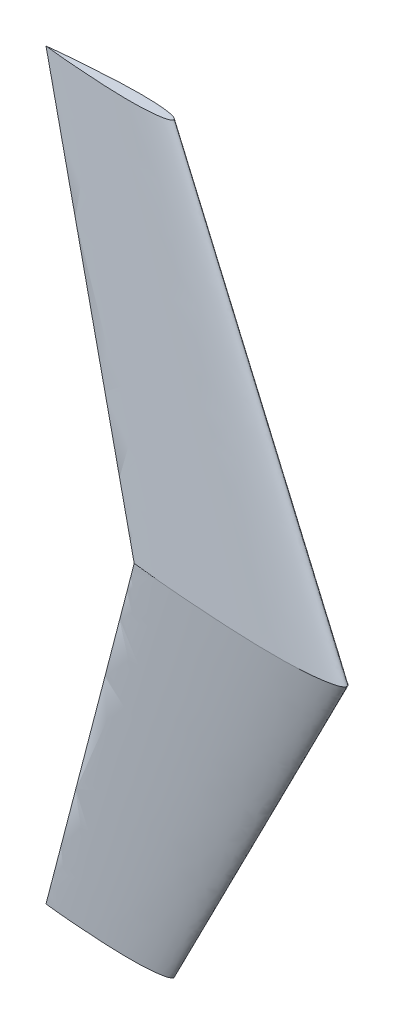
ISO-10303-21;
HEADER;
FILE_DESCRIPTION(('STEP AP214'),'2;1');
FILE_NAME('part.step','',(''),(''),'','','');
FILE_SCHEMA(('AUTOMOTIVE_DESIGN { 1 0 10303 214 1 1 1 1 }'));
ENDSEC;
DATA;
#1=APPLICATION_CONTEXT('core data for automotive mechanical design processes');
#2=APPLICATION_PROTOCOL_DEFINITION('international standard','automotive_design',2000,#1);
#3=PRODUCT_CONTEXT('',#1,'mechanical');
#4=PRODUCT('Part','Part','',(#3));
#5=PRODUCT_RELATED_PRODUCT_CATEGORY('part','',(#4));
#6=PRODUCT_DEFINITION_FORMATION('','',#4);
#7=PRODUCT_DEFINITION_CONTEXT('part definition',#1,'design');
#8=PRODUCT_DEFINITION('design','',#6,#7);
#9=PRODUCT_DEFINITION_SHAPE('','',#8);
#10=(LENGTH_UNIT() NAMED_UNIT(*) SI_UNIT(.MILLI.,.METRE.));
#11=(NAMED_UNIT(*) PLANE_ANGLE_UNIT() SI_UNIT($,.RADIAN.));
#12=(NAMED_UNIT(*) SI_UNIT($,.STERADIAN.) SOLID_ANGLE_UNIT());
#13=UNCERTAINTY_MEASURE_WITH_UNIT(LENGTH_MEASURE(1.E-05),#10,'distance_accuracy_value','');
#14=(GEOMETRIC_REPRESENTATION_CONTEXT(3) GLOBAL_UNCERTAINTY_ASSIGNED_CONTEXT((#13)) GLOBAL_UNIT_ASSIGNED_CONTEXT((#10,
#11,#12)) REPRESENTATION_CONTEXT('',''));
#15=CARTESIAN_POINT('',(0.,0.,0.));
#16=DIRECTION('',(0.,0.,1.));
#17=DIRECTION('',(1.,0.,0.));
#18=AXIS2_PLACEMENT_3D('',#15,#16,#17);
#19=CARTESIAN_POINT('',(-5628.121523,10153.4,-888.307396177392));
#20=DIRECTION('',(1.77927965913824E-13,1.,-5.34588143750608E-13));
#21=DIRECTION('',(0.,5.34588143750608E-13,1.));
#22=AXIS2_PLACEMENT_3D('',#19,#20,#21);
#23=PLANE('',#22);
#24=CARTESIAN_POINT('',(-9121.721523,10153.4,-888.3073962));
#25=CARTESIAN_POINT('',(-9121.721523,10153.4,-888.974816669693));
#26=CARTESIAN_POINT('',(-9089.80834370601,10153.4,-891.63024737088));
#27=CARTESIAN_POINT('',(-9057.07807668989,10153.4,-897.171405392857));
#28=CARTESIAN_POINT('',(-8977.57388229286,10153.4,-905.666450738965));
#29=CARTESIAN_POINT('',(-8879.8916576995,10153.4,-916.211213285361));
#30=CARTESIAN_POINT('',(-8752.61238274034,10153.4,-928.585402677725));
#31=CARTESIAN_POINT('',(-8603.17951082771,10153.4,-942.241130984125));
#32=CARTESIAN_POINT('',(-8432.2468479322,10153.4,-956.914696759061));
#33=CARTESIAN_POINT('',(-8243.39126601854,10153.4,-972.176720474523));
#34=CARTESIAN_POINT('',(-8039.62375209268,10153.4,-987.417587350232));
#35=CARTESIAN_POINT('',(-7824.49730132489,10153.4,-1002.18570012597));
#36=CARTESIAN_POINT('',(-7601.67730037031,10153.4,-1015.80150482923));
#37=CARTESIAN_POINT('',(-7374.97893645967,10153.4,-1027.68839431318));
#38=CARTESIAN_POINT('',(-7148.27296099901,10153.4,-1037.13975746941));
#39=CARTESIAN_POINT('',(-6961.08105832747,10153.4,-1042.59965221595));
#40=CARTESIAN_POINT('',(-6814.23966431603,10153.4,-1045.10788952415));
#41=CARTESIAN_POINT('',(-6707.41289657917,10153.4,-1045.99805136974));
#42=CARTESIAN_POINT('',(-6603.4371020191,10153.4,-1045.87370662947));
#43=CARTESIAN_POINT('',(-6502.75699124945,10153.4,-1044.53525924528));
#44=CARTESIAN_POINT('',(-6405.81153599954,10153.4,-1042.18583949877));
#45=CARTESIAN_POINT('',(-6313.02388840633,10153.4,-1038.63770697407));
#46=CARTESIAN_POINT('',(-6224.78401727369,10153.4,-1034.0200573746));
#47=CARTESIAN_POINT('',(-6141.45810716094,10153.4,-1028.2252491425));
#48=CARTESIAN_POINT('',(-6063.39947988272,10153.4,-1021.35133542185));
#49=CARTESIAN_POINT('',(-5990.96762169054,10153.4,-1013.33813074817));
#50=CARTESIAN_POINT('',(-5924.46444227649,10153.4,-1004.33839910324));
#51=CARTESIAN_POINT('',(-5864.1499720886,10153.4,-994.584147275895));
#52=CARTESIAN_POINT('',(-5810.27540371019,10153.4,-984.119063415404));
#53=CARTESIAN_POINT('',(-5763.01575074453,10153.4,-972.979415581756));
#54=CARTESIAN_POINT('',(-5722.59481583761,10153.4,-960.790053576644));
#55=CARTESIAN_POINT('',(-5689.10033375971,10153.4,-947.325206497993));
#56=CARTESIAN_POINT('',(-5662.83877573881,10153.4,-932.468600499724));
#57=CARTESIAN_POINT('',(-5643.95351173923,10153.4,-916.955025126858));
#58=CARTESIAN_POINT('',(-5632.15953276547,10153.4,-902.736217299538));
#59=CARTESIAN_POINT('',(-5626.4691700562,10153.4,-888.307396200001));
#60=CARTESIAN_POINT('',(-5632.15953276547,10153.4,-873.878575100461));
#61=CARTESIAN_POINT('',(-5643.95351173923,10153.4,-859.659767273147));
#62=CARTESIAN_POINT('',(-5662.83877573881,10153.4,-844.146191900249));
#63=CARTESIAN_POINT('',(-5689.10033375973,10153.4,-829.289585902141));
#64=CARTESIAN_POINT('',(-5722.59481583751,10153.4,-815.824738822703));
#65=CARTESIAN_POINT('',(-5763.01575074503,10153.4,-803.635376821323));
#66=CARTESIAN_POINT('',(-5810.27540370789,10153.4,-792.495728970488));
#67=CARTESIAN_POINT('',(-5864.14997210943,10153.4,-782.030645185124));
#68=CARTESIAN_POINT('',(-5924.46444225284,10153.4,-772.276393018456));
#69=CARTESIAN_POINT('',(-5990.9676216945,10153.4,-763.276661476122));
#70=CARTESIAN_POINT('',(-6063.39947988153,10153.4,-755.263456770866));
#71=CARTESIAN_POINT('',(-6141.45810716129,10153.4,-748.389543059651));
#72=CARTESIAN_POINT('',(-6224.78401727359,10153.4,-742.594734824774));
#73=CARTESIAN_POINT('',(-6313.02388840636,10153.4,-737.977085226116));
#74=CARTESIAN_POINT('',(-6405.81153599953,10153.4,-734.428952701176));
#75=CARTESIAN_POINT('',(-6502.75699124945,10153.4,-732.079532954734));
#76=CARTESIAN_POINT('',(-6603.4371020191,10153.4,-730.741085570528));
#77=CARTESIAN_POINT('',(-6707.41289657917,10153.4,-730.61674083025));
#78=CARTESIAN_POINT('',(-6814.23966431603,10153.4,-731.506902675879));
#79=CARTESIAN_POINT('',(-6961.08105832748,10153.4,-734.015139983863));
#80=CARTESIAN_POINT('',(-7148.27296099891,10153.4,-739.475034732124));
#81=CARTESIAN_POINT('',(-7374.97893646006,10153.4,-748.926397881113));
#82=CARTESIAN_POINT('',(-7601.67730036887,10153.4,-760.813287391874));
#83=CARTESIAN_POINT('',(-7824.49730133466,10153.4,-774.429091998114));
#84=CARTESIAN_POINT('',(-8039.62375208343,10153.4,-789.197205118076));
#85=CARTESIAN_POINT('',(-8243.39126601967,10153.4,-804.438071908887));
#86=CARTESIAN_POINT('',(-8432.24684793194,10153.4,-819.700095644806));
#87=CARTESIAN_POINT('',(-8603.17951082777,10153.4,-834.373661415011));
#88=CARTESIAN_POINT('',(-8752.61238274033,10153.4,-848.029389722457));
#89=CARTESIAN_POINT('',(-8879.89165769951,10153.4,-860.403579114603));
#90=CARTESIAN_POINT('',(-8977.57388229286,10153.4,-870.948341661041));
#91=CARTESIAN_POINT('',(-9057.07807668988,10153.4,-879.443387007142));
#92=CARTESIAN_POINT('',(-9089.80834370601,10153.4,-884.98454502912));
#93=CARTESIAN_POINT('',(-9121.721523,10153.4,-887.639975730307));
#94=CARTESIAN_POINT('',(-9121.721523,10153.4,-888.3073962));
#95=B_SPLINE_CURVE_WITH_KNOTS('',3,(#24,#25,#26,#27,#28,#29,#30,#31,#32,#33,#34,#35,#36,#37,#38,
#39,#40,#41,#42,#43,#44,#45,#46,#47,#48,#49,#50,#51,#52,#53,#54,#55,#56,#57,#58,#59,#60,#61,#62,
#63,#64,#65,#66,#67,#68,#69,#70,#71,#72,#73,#74,#75,#76,#77,#78,#79,#80,#81,#82,#83,#84,#85,#86,
#87,#88,#89,#90,#91,#92,#93,#94),.UNSPECIFIED.,.T.,.F.,(4,1,1,1,1,1,1,1,1,1,1,1,1,1,1,1,1,1,1,1,
1,1,1,1,1,1,1,1,1,1,1,1,1,1,1,1,1,1,1,1,1,1,1,1,1,1,1,1,1,1,1,1,1,1,1,1,1,1,1,1,1,1,1,1,1,1,1,1,
4),(0.,0.00213342749538195,0.00848815570879811,0.0189444871419724,0.0333191137757772,
0.051356294097503,0.0727560928989506,0.0971408174358906,0.124097488783317,0.153162556778746,
0.183833917660925,0.215589374458577,0.247878194576681,0.28015086786396,0.311860397032497,
0.327332942728669,0.342462846119806,0.357187102447196,0.371448118352098,0.3851834410432,
0.398331272585365,0.410844637192147,0.422672607168122,0.433769314474381,0.444090175229727,
0.453589411783167,0.462240439840988,0.470010037321853,0.476870984673605,0.482833353060145,
0.487908551347961,0.49215516357988,0.495592273390568,0.498196358981456,0.499999999996756,
0.501803641012056,0.504407726602943,0.507844836413632,0.51209144864555,0.517166646933366,
0.523129015319906,0.529989962671659,0.537759560152524,0.5464105882149,0.55590982476834,
0.566230685523686,0.577327392829945,0.58915536280592,0.601668727412703,0.614816558954868,
0.628551881645969,0.642812897550872,0.657537153878262,0.672667057269399,0.68813960296557,
0.719849132134108,0.752121805421387,0.784410625539491,0.816166082337143,0.846837443221254,
0.875902511216683,0.902859182564109,0.927243907101049,0.948643705902497,0.966680886224223,
0.981055512858028,0.991511844291202,0.997866572504618,1.),.UNSPECIFIED.);
#96=CARTESIAN_POINT('',(-9121.721523,10153.4,-888.3073962));
#97=VERTEX_POINT('',#96);
#98=EDGE_CURVE('E72',#97,#97,#95,.T.);
#99=ORIENTED_EDGE('',*,*,#98,.F.);
#100=EDGE_LOOP('',(#99));
#101=FACE_BOUND('',#100,.T.);
#102=ADVANCED_FACE('F59',(#101),#23,.T.);
#103=CARTESIAN_POINT('',(-9121.721523,10153.4,-888.307396200006));
#104=CARTESIAN_POINT('',(-5822.7,0.,-9.38669714872775E-12));
#105=CARTESIAN_POINT('',(-9121.72152299996,10153.4,-888.974816669696));
#106=CARTESIAN_POINT('',(-5822.69999999993,0.,-1.11237381752387));
#107=CARTESIAN_POINT('',(-9089.80834370601,10153.4,-891.63024737088));
#108=CARTESIAN_POINT('',(-5769.51106335152,0.,-5.53811698897455));
#109=CARTESIAN_POINT('',(-9057.07807668989,10153.4,-897.171405392857));
#110=CARTESIAN_POINT('',(-5714.96030603678,0.,-14.7734332285468));
#111=CARTESIAN_POINT('',(-8977.57388229286,10153.4,-905.666450738965));
#112=CARTESIAN_POINT('',(-5582.45255680517,0.,-28.9319231921214));
#113=CARTESIAN_POINT('',(-8879.8916576995,10153.4,-916.211213285361));
#114=CARTESIAN_POINT('',(-5419.64791713842,0.,-46.5066280464677));
#115=CARTESIAN_POINT('',(-8752.61238274034,10153.4,-928.585402677725));
#116=CARTESIAN_POINT('',(-5207.51457780227,0.,-67.1303950986916));
#117=CARTESIAN_POINT('',(-8603.17951082771,10153.4,-942.241130984125));
#118=CARTESIAN_POINT('',(-4958.458365504,0.,-89.8900725705726));
#119=CARTESIAN_POINT('',(-8432.2468479322,10153.4,-956.914696759061));
#120=CARTESIAN_POINT('',(-4673.56896309857,0.,-114.346155525168));
#121=CARTESIAN_POINT('',(-8243.39126601854,10153.4,-972.176720474523));
#122=CARTESIAN_POINT('',(-4358.80785799194,0.,-139.783007370581));
#123=CARTESIAN_POINT('',(-8039.62375209268,10153.4,-987.417587350232));
#124=CARTESIAN_POINT('',(-4019.19339056678,0.,-165.184597438951));
#125=CARTESIAN_POINT('',(-7824.49730132489,10153.4,-1002.18570012597));
#126=CARTESIAN_POINT('',(-3660.64725340886,0.,-189.798260211908));
#127=CARTESIAN_POINT('',(-7601.67730037031,10153.4,-1015.80150482923));
#128=CARTESIAN_POINT('',(-3289.27845914978,0.,-212.491397800858));
#129=CARTESIAN_POINT('',(-7374.97893645967,10153.4,-1027.68839431318));
#130=CARTESIAN_POINT('',(-2911.4456896479,0.,-232.302993734654));
#131=CARTESIAN_POINT('',(-7148.27296099901,10153.4,-1037.13975746941));
#132=CARTESIAN_POINT('',(-2533.60023415281,0.,-248.055355827514));
#133=CARTESIAN_POINT('',(-6961.08105832747,10153.4,-1042.59965221595));
#134=CARTESIAN_POINT('',(-2221.61194365449,0.,-257.155232502204));
#135=CARTESIAN_POINT('',(-6814.23966431603,10153.4,-1045.10788952415));
#136=CARTESIAN_POINT('',(-1976.87488591735,0.,-261.335651947246));
#137=CARTESIAN_POINT('',(-6707.41289657917,10153.4,-1045.99805136974));
#138=CARTESIAN_POINT('',(-1798.829253761,0.,-262.819263516556));
#139=CARTESIAN_POINT('',(-6603.4371020191,10153.4,-1045.87370662947));
#140=CARTESIAN_POINT('',(-1625.53527076784,0.,-262.612021096356));
#141=CARTESIAN_POINT('',(-6502.75699124945,10153.4,-1044.53525924528));
#142=CARTESIAN_POINT('',(-1457.73412553701,0.,-260.381262685543));
#143=CARTESIAN_POINT('',(-6405.81153599954,10153.4,-1042.18583949877));
#144=CARTESIAN_POINT('',(-1296.15744180569,0.,-256.465540691723));
#145=CARTESIAN_POINT('',(-6313.02388840633,10153.4,-1038.63770697407));
#146=CARTESIAN_POINT('',(-1141.510477173,0.,-250.551952629848));
#147=CARTESIAN_POINT('',(-6224.78401727369,10153.4,-1034.0200573746));
#148=CARTESIAN_POINT('',(-994.44318336582,0.,-242.855825907239));
#149=CARTESIAN_POINT('',(-6141.45810716094,10153.4,-1028.2252491425));
#150=CARTESIAN_POINT('',(-855.565871478116,0.,-233.197756892693));
#151=CARTESIAN_POINT('',(-6063.39947988272,10153.4,-1021.35133542185));
#152=CARTESIAN_POINT('',(-725.467414567803,0.,-221.741168454894));
#153=CARTESIAN_POINT('',(-5990.96762169054,10153.4,-1013.33813074817));
#154=CARTESIAN_POINT('',(-604.746959831828,0.,-208.385750823428));
#155=CARTESIAN_POINT('',(-5924.46444227649,10153.4,-1004.33839910324));
#156=CARTESIAN_POINT('',(-493.907692905169,0.,-193.386112384125));
#157=CARTESIAN_POINT('',(-5864.1499720886,10153.4,-994.584147275895));
#158=CARTESIAN_POINT('',(-393.383000523673,0.,-177.128932371856));
#159=CARTESIAN_POINT('',(-5810.27540371019,10153.4,-984.119063415404));
#160=CARTESIAN_POINT('',(-303.591539156693,0.,-159.68702621287));
#161=CARTESIAN_POINT('',(-5763.01575074453,10153.4,-972.979415581756));
#162=CARTESIAN_POINT('',(-224.824999968807,0.,-141.120840175241));
#163=CARTESIAN_POINT('',(-5722.59481583761,10153.4,-960.790053576644));
#164=CARTESIAN_POINT('',(-157.456389456419,0.,-120.805120537779));
#165=CARTESIAN_POINT('',(-5689.10033375971,10153.4,-947.325206497993));
#166=CARTESIAN_POINT('',(-101.631933080685,0.,-98.3635802671582));
#167=CARTESIAN_POINT('',(-5662.83877573881,10153.4,-932.468600499724));
#168=CARTESIAN_POINT('',(-57.8624191442167,0.,-73.602428519623));
#169=CARTESIAN_POINT('',(-5643.95351173923,10153.4,-916.955025126858));
#170=CARTESIAN_POINT('',(-26.3867989557736,0.,-47.7463215457956));
#171=CARTESIAN_POINT('',(-5632.15953276547,10153.4,-902.736217299538));
#172=CARTESIAN_POINT('',(-6.73005480347565,0.,-24.048172834979));
#173=CARTESIAN_POINT('',(-5626.4691700562,10153.4,-888.307396200001));
#174=CARTESIAN_POINT('',(2.75393733851964,0.,4.20672139197262E-13));
#175=CARTESIAN_POINT('',(-5632.15953276547,10153.4,-873.878575100461));
#176=CARTESIAN_POINT('',(-6.73005480347553,0.,24.0481728349785));
#177=CARTESIAN_POINT('',(-5643.95351173923,10153.4,-859.659767273147));
#178=CARTESIAN_POINT('',(-26.386798955773,0.,47.7463215457953));
#179=CARTESIAN_POINT('',(-5662.83877573881,10153.4,-844.146191900249));
#180=CARTESIAN_POINT('',(-57.8624191442174,0.,73.6024285196235));
#181=CARTESIAN_POINT('',(-5689.10033375973,10153.4,-829.289585902141));
#182=CARTESIAN_POINT('',(-101.631933080686,0.,98.3635802671585));
#183=CARTESIAN_POINT('',(-5722.59481583751,10153.4,-815.824738822703));
#184=CARTESIAN_POINT('',(-157.456389456417,0.,120.805120537779));
#185=CARTESIAN_POINT('',(-5763.01575074503,10153.4,-803.635376821323));
#186=CARTESIAN_POINT('',(-224.824999968807,0.,141.120840175241));
#187=CARTESIAN_POINT('',(-5810.27540370789,10153.4,-792.495728970488));
#188=CARTESIAN_POINT('',(-303.591539156693,0.,159.68702621287));
#189=CARTESIAN_POINT('',(-5864.14997210943,10153.4,-782.030645185124));
#190=CARTESIAN_POINT('',(-393.383000523672,0.,177.128932371856));
#191=CARTESIAN_POINT('',(-5924.46444225284,10153.4,-772.276393018456));
#192=CARTESIAN_POINT('',(-493.90769290517,0.,193.386112384126));
#193=CARTESIAN_POINT('',(-5990.9676216945,10153.4,-763.276661476122));
#194=CARTESIAN_POINT('',(-604.746959831827,0.,208.385750823427));
#195=CARTESIAN_POINT('',(-6063.39947988153,10153.4,-755.263456770866));
#196=CARTESIAN_POINT('',(-725.467414567803,0.,221.741168454894));
#197=CARTESIAN_POINT('',(-6141.45810716129,10153.4,-748.389543059651));
#198=CARTESIAN_POINT('',(-855.565871478118,0.,233.197756892693));
#199=CARTESIAN_POINT('',(-6224.78401727359,10153.4,-742.594734824774));
#200=CARTESIAN_POINT('',(-994.443183365818,0.,242.855825907239));
#201=CARTESIAN_POINT('',(-6313.02388840636,10153.4,-737.977085226116));
#202=CARTESIAN_POINT('',(-1141.51047717301,0.,250.551952629848));
#203=CARTESIAN_POINT('',(-6405.81153599953,10153.4,-734.428952701176));
#204=CARTESIAN_POINT('',(-1296.15744180569,0.,256.465540691723));
#205=CARTESIAN_POINT('',(-6502.75699124945,10153.4,-732.079532954734));
#206=CARTESIAN_POINT('',(-1457.73412553701,0.,260.381262685543));
#207=CARTESIAN_POINT('',(-6603.4371020191,10153.4,-730.741085570528));
#208=CARTESIAN_POINT('',(-1625.53527076784,0.,262.612021096356));
#209=CARTESIAN_POINT('',(-6707.41289657917,10153.4,-730.61674083025));
#210=CARTESIAN_POINT('',(-1798.829253761,0.,262.819263516556));
#211=CARTESIAN_POINT('',(-6814.23966431603,10153.4,-731.506902675879));
#212=CARTESIAN_POINT('',(-1976.87488591735,0.,261.335651947246));
#213=CARTESIAN_POINT('',(-6961.08105832748,10153.4,-734.015139983863));
#214=CARTESIAN_POINT('',(-2221.61194365449,0.,257.155232502204));
#215=CARTESIAN_POINT('',(-7148.27296099891,10153.4,-739.475034732124));
#216=CARTESIAN_POINT('',(-2533.60023415281,0.,248.055355827513));
#217=CARTESIAN_POINT('',(-7374.97893646006,10153.4,-748.926397881113));
#218=CARTESIAN_POINT('',(-2911.4456896479,0.,232.302993734654));
#219=CARTESIAN_POINT('',(-7601.67730036887,10153.4,-760.813287391874));
#220=CARTESIAN_POINT('',(-3289.27845914979,0.,212.491397800858));
#221=CARTESIAN_POINT('',(-7824.49730133466,10153.4,-774.429091998114));
#222=CARTESIAN_POINT('',(-3660.64725340886,0.,189.798260211908));
#223=CARTESIAN_POINT('',(-8039.62375208343,10153.4,-789.197205118076));
#224=CARTESIAN_POINT('',(-4019.19339056678,0.,165.184597438951));
#225=CARTESIAN_POINT('',(-8243.39126601967,10153.4,-804.438071908887));
#226=CARTESIAN_POINT('',(-4358.80785799195,0.,139.783007370581));
#227=CARTESIAN_POINT('',(-8432.24684793194,10153.4,-819.700095644806));
#228=CARTESIAN_POINT('',(-4673.56896309857,0.,114.346155525168));
#229=CARTESIAN_POINT('',(-8603.17951082777,10153.4,-834.373661415011));
#230=CARTESIAN_POINT('',(-4958.45836550399,0.,89.8900725705725));
#231=CARTESIAN_POINT('',(-8752.61238274033,10153.4,-848.029389722457));
#232=CARTESIAN_POINT('',(-5207.51457780227,0.,67.1303950986916));
#233=CARTESIAN_POINT('',(-8879.89165769951,10153.4,-860.403579114603));
#234=CARTESIAN_POINT('',(-5419.64791713842,0.,46.5066280464679));
#235=CARTESIAN_POINT('',(-8977.57388229286,10153.4,-870.948341661041));
#236=CARTESIAN_POINT('',(-5582.45255680517,0.,28.9319231921212));
#237=CARTESIAN_POINT('',(-9057.07807668988,10153.4,-879.443387007142));
#238=CARTESIAN_POINT('',(-5714.96030603677,0.,14.773433228547));
#239=CARTESIAN_POINT('',(-9089.80834370601,10153.4,-884.98454502912));
#240=CARTESIAN_POINT('',(-5769.51106335152,0.,5.53811698897433));
#241=CARTESIAN_POINT('',(-9121.72152300004,10153.4,-887.639975730311));
#242=CARTESIAN_POINT('',(-5822.70000000007,0.,1.11237381751238));
#243=CARTESIAN_POINT('',(-9121.721523,10153.4,-888.307396200006));
#244=CARTESIAN_POINT('',(-5822.7,0.,-9.38669714872775E-12));
#245=B_SPLINE_SURFACE_WITH_KNOTS('',3,1,((#103,#104),(#105,#106),(#107,#108),(#109,#110),(#111,
#112),(#113,#114),(#115,#116),(#117,#118),(#119,#120),(#121,#122),(#123,#124),(#125,#126),(#127,
#128),(#129,#130),(#131,#132),(#133,#134),(#135,#136),(#137,#138),(#139,#140),(#141,#142),(#143,
#144),(#145,#146),(#147,#148),(#149,#150),(#151,#152),(#153,#154),(#155,#156),(#157,#158),(#159,
#160),(#161,#162),(#163,#164),(#165,#166),(#167,#168),(#169,#170),(#171,#172),(#173,#174),(#175,
#176),(#177,#178),(#179,#180),(#181,#182),(#183,#184),(#185,#186),(#187,#188),(#189,#190),(#191,
#192),(#193,#194),(#195,#196),(#197,#198),(#199,#200),(#201,#202),(#203,#204),(#205,#206),(#207,
#208),(#209,#210),(#211,#212),(#213,#214),(#215,#216),(#217,#218),(#219,#220),(#221,#222),(#223,
#224),(#225,#226),(#227,#228),(#229,#230),(#231,#232),(#233,#234),(#235,#236),(#237,#238),(#239,
#240),(#241,#242),(#243,#244)),.UNSPECIFIED.,.T.,.F.,.F.,(4,1,1,1,1,1,1,1,1,1,1,1,1,1,1,1,1,1,1,
1,1,1,1,1,1,1,1,1,1,1,1,1,1,1,1,1,1,1,1,1,1,1,1,1,1,1,1,1,1,1,1,1,1,1,1,1,1,1,1,1,1,1,1,1,1,1,1,
1,4),(2,2),(0.,0.00213342749536811,0.00848815570874321,0.0189444871418497,0.033319113775561,
0.0513562940971698,0.0727560928984787,0.0971408174352606,0.124097488782512,0.153162556777752,
0.183833917660925,0.215589374458577,0.247878194576681,0.28015086786396,0.311860397032406,
0.327332942728477,0.342462846119516,0.35718710244681,0.371448118351621,0.385183441042633,
0.398331272584713,0.410844637191414,0.422672607167312,0.433769314473499,0.444090175228778,
0.453589411782156,0.462240439840988,0.470010037321853,0.476870984673605,0.482833353060145,
0.487908551347961,0.49215516357988,0.495592273390568,0.498196358981456,0.499999999996756,
0.501803641012056,0.504407726602943,0.507844836413632,0.51209144864555,0.517166646933366,
0.523129015319906,0.529989962671659,0.537759560152524,0.5464105882149,0.55590982476834,
0.566230685523686,0.577327392829945,0.58915536280592,0.601668727412703,0.614816558954868,
0.628551881645969,0.642812897550872,0.657537153878262,0.672667057269399,0.68813960296557,
0.719849132134108,0.752121805421387,0.784410625539491,0.816166082337143,0.846837443221254,
0.875902511216683,0.902859182564109,0.927243907101049,0.948643705902497,0.966680886224223,
0.981055512858028,0.991511844291202,0.997866572504618,1.),(0.,1.),.UNSPECIFIED.);
#246=CARTESIAN_POINT('',(-5822.7,0.,0.));
#247=CARTESIAN_POINT('',(-5822.7,0.,-1.11237381751809));
#248=CARTESIAN_POINT('',(-5769.51106335152,0.,-5.53811698897455));
#249=CARTESIAN_POINT('',(-5714.96030603678,0.,-14.7734332285468));
#250=CARTESIAN_POINT('',(-5582.45255680517,0.,-28.9319231921214));
#251=CARTESIAN_POINT('',(-5419.64791713842,0.,-46.5066280464677));
#252=CARTESIAN_POINT('',(-5207.51457780227,0.,-67.1303950986916));
#253=CARTESIAN_POINT('',(-4958.458365504,0.,-89.8900725705726));
#254=CARTESIAN_POINT('',(-4673.56896309857,0.,-114.346155525168));
#255=CARTESIAN_POINT('',(-4358.80785799194,0.,-139.783007370581));
#256=CARTESIAN_POINT('',(-4019.19339056678,0.,-165.184597438951));
#257=CARTESIAN_POINT('',(-3660.64725340886,0.,-189.798260211908));
#258=CARTESIAN_POINT('',(-3289.27845914978,0.,-212.491397800858));
#259=CARTESIAN_POINT('',(-2911.4456896479,0.,-232.302993734654));
#260=CARTESIAN_POINT('',(-2533.60023415281,0.,-248.055355827514));
#261=CARTESIAN_POINT('',(-2221.61194365449,0.,-257.155232502204));
#262=CARTESIAN_POINT('',(-1976.87488591735,0.,-261.335651947246));
#263=CARTESIAN_POINT('',(-1798.829253761,0.,-262.819263516556));
#264=CARTESIAN_POINT('',(-1625.53527076784,0.,-262.612021096356));
#265=CARTESIAN_POINT('',(-1457.73412553701,0.,-260.381262685543));
#266=CARTESIAN_POINT('',(-1296.15744180569,0.,-256.465540691723));
#267=CARTESIAN_POINT('',(-1141.510477173,0.,-250.551952629848));
#268=CARTESIAN_POINT('',(-994.44318336582,0.,-242.855825907239));
#269=CARTESIAN_POINT('',(-855.565871478116,0.,-233.197756892693));
#270=CARTESIAN_POINT('',(-725.467414567803,0.,-221.741168454894));
#271=CARTESIAN_POINT('',(-604.746959831828,0.,-208.385750823428));
#272=CARTESIAN_POINT('',(-493.907692905169,0.,-193.386112384125));
#273=CARTESIAN_POINT('',(-393.383000523673,0.,-177.128932371856));
#274=CARTESIAN_POINT('',(-303.591539156693,0.,-159.68702621287));
#275=CARTESIAN_POINT('',(-224.824999968807,0.,-141.120840175241));
#276=CARTESIAN_POINT('',(-157.456389456419,0.,-120.805120537779));
#277=CARTESIAN_POINT('',(-101.631933080685,0.,-98.3635802671582));
#278=CARTESIAN_POINT('',(-57.8624191442167,0.,-73.602428519623));
#279=CARTESIAN_POINT('',(-26.3867989557736,0.,-47.7463215457956));
#280=CARTESIAN_POINT('',(-6.73005480347565,0.,-24.048172834979));
#281=CARTESIAN_POINT('',(2.75393733851964,0.,4.20672139197262E-13));
#282=CARTESIAN_POINT('',(-6.73005480347553,0.,24.0481728349785));
#283=CARTESIAN_POINT('',(-26.386798955773,0.,47.7463215457953));
#284=CARTESIAN_POINT('',(-57.8624191442174,0.,73.6024285196235));
#285=CARTESIAN_POINT('',(-101.631933080686,0.,98.3635802671585));
#286=CARTESIAN_POINT('',(-157.456389456417,0.,120.805120537779));
#287=CARTESIAN_POINT('',(-224.824999968807,0.,141.120840175241));
#288=CARTESIAN_POINT('',(-303.591539156693,0.,159.68702621287));
#289=CARTESIAN_POINT('',(-393.383000523672,0.,177.128932371856));
#290=CARTESIAN_POINT('',(-493.90769290517,0.,193.386112384126));
#291=CARTESIAN_POINT('',(-604.746959831827,0.,208.385750823427));
#292=CARTESIAN_POINT('',(-725.467414567803,0.,221.741168454894));
#293=CARTESIAN_POINT('',(-855.565871478118,0.,233.197756892693));
#294=CARTESIAN_POINT('',(-994.443183365818,0.,242.855825907239));
#295=CARTESIAN_POINT('',(-1141.51047717301,0.,250.551952629848));
#296=CARTESIAN_POINT('',(-1296.15744180569,0.,256.465540691723));
#297=CARTESIAN_POINT('',(-1457.73412553701,0.,260.381262685543));
#298=CARTESIAN_POINT('',(-1625.53527076784,0.,262.612021096356));
#299=CARTESIAN_POINT('',(-1798.829253761,0.,262.819263516556));
#300=CARTESIAN_POINT('',(-1976.87488591735,0.,261.335651947246));
#301=CARTESIAN_POINT('',(-2221.61194365449,0.,257.155232502204));
#302=CARTESIAN_POINT('',(-2533.60023415281,0.,248.055355827513));
#303=CARTESIAN_POINT('',(-2911.4456896479,0.,232.302993734654));
#304=CARTESIAN_POINT('',(-3289.27845914979,0.,212.491397800858));
#305=CARTESIAN_POINT('',(-3660.64725340886,0.,189.798260211908));
#306=CARTESIAN_POINT('',(-4019.19339056678,0.,165.184597438951));
#307=CARTESIAN_POINT('',(-4358.80785799195,0.,139.783007370581));
#308=CARTESIAN_POINT('',(-4673.56896309857,0.,114.346155525168));
#309=CARTESIAN_POINT('',(-4958.45836550399,0.,89.8900725705725));
#310=CARTESIAN_POINT('',(-5207.51457780227,0.,67.1303950986916));
#311=CARTESIAN_POINT('',(-5419.64791713842,0.,46.5066280464679));
#312=CARTESIAN_POINT('',(-5582.45255680517,0.,28.9319231921212));
#313=CARTESIAN_POINT('',(-5714.96030603677,0.,14.773433228547));
#314=CARTESIAN_POINT('',(-5769.51106335152,0.,5.53811698897433));
#315=CARTESIAN_POINT('',(-5822.7,0.,1.11237381751813));
#316=CARTESIAN_POINT('',(-5822.7,0.,0.));
#317=B_SPLINE_CURVE_WITH_KNOTS('',3,(#246,#247,#248,#249,#250,#251,#252,#253,#254,#255,#256,
#257,#258,#259,#260,#261,#262,#263,#264,#265,#266,#267,#268,#269,#270,#271,#272,#273,#274,#275,
#276,#277,#278,#279,#280,#281,#282,#283,#284,#285,#286,#287,#288,#289,#290,#291,#292,#293,#294,
#295,#296,#297,#298,#299,#300,#301,#302,#303,#304,#305,#306,#307,#308,#309,#310,#311,#312,#313,
#314,#315,#316),.UNSPECIFIED.,.T.,.F.,(4,1,1,1,1,1,1,1,1,1,1,1,1,1,1,1,1,1,1,1,1,1,1,1,1,1,1,1,
1,1,1,1,1,1,1,1,1,1,1,1,1,1,1,1,1,1,1,1,1,1,1,1,1,1,1,1,1,1,1,1,1,1,1,1,1,1,1,1,4),(0.,
0.00213342749536811,0.00848815570874321,0.0189444871418497,0.033319113775561,0.0513562940971698,
0.0727560928984787,0.0971408174352606,0.124097488782512,0.153162556777752,0.183833917661664,
0.21558937445911,0.247878194577005,0.280150867864074,0.311860397032406,0.327332942728477,
0.342462846119516,0.35718710244681,0.371448118351621,0.385183441042633,0.398331272584713,
0.410844637191414,0.422672607167312,0.433769314473499,0.444090175228778,0.453589411782156,
0.462240439844477,0.470010037325291,0.476870984677,0.482833353063501,0.487908551351284,
0.492155163583175,0.495592273393841,0.498196358984712,0.5,0.501803641015288,0.504407726606159,
0.507844836416825,0.512091448648716,0.517166646936499,0.523129015323,0.529989962674709,
0.537759560155523,0.546410588217843,0.555909824771222,0.566230685526501,0.577327392832687,
0.589155362808586,0.601668727415287,0.614816558957367,0.628551881648379,0.642812897553189,
0.657537153880484,0.672667057271523,0.688139602967594,0.719849132135926,0.752121805422995,
0.78441062554089,0.816166082338336,0.846837443222248,0.875902511217488,0.90285918256474,
0.927243907101521,0.94864370590283,0.966680886224439,0.98105551285815,0.991511844291257,
0.997866572504632,1.),.UNSPECIFIED.);
#318=CARTESIAN_POINT('',(-5822.7,0.,0.));
#319=VERTEX_POINT('',#318);
#320=EDGE_CURVE('E11',#319,#319,#317,.T.);
#321=ORIENTED_EDGE('',*,*,#98,.T.);
#322=EDGE_LOOP('',(#321));
#323=FACE_BOUND('',#322,.T.);
#324=ORIENTED_EDGE('',*,*,#320,.F.);
#325=EDGE_LOOP('',(#324));
#326=FACE_BOUND('',#325,.T.);
#327=ADVANCED_FACE('F61',(#323,#326),#245,.T.);
#328=CARTESIAN_POINT('',(-5628.121523,-10153.4,-888.307396177392));
#329=DIRECTION('',(1.77927965913824E-13,-1.,-5.34588143750608E-13));
#330=DIRECTION('',(0.,-5.34588143750608E-13,1.));
#331=AXIS2_PLACEMENT_3D('',#328,#329,#330);
#332=PLANE('',#331);
#333=CARTESIAN_POINT('',(-9121.721523,-10153.4,-888.3073962));
#334=CARTESIAN_POINT('',(-9121.721523,-10153.4,-888.974816669693));
#335=CARTESIAN_POINT('',(-9089.80834370601,-10153.4,-891.63024737088));
#336=CARTESIAN_POINT('',(-9057.07807668989,-10153.4,-897.171405392857));
#337=CARTESIAN_POINT('',(-8977.57388229286,-10153.4,-905.666450738965));
#338=CARTESIAN_POINT('',(-8879.8916576995,-10153.4,-916.211213285361));
#339=CARTESIAN_POINT('',(-8752.61238274034,-10153.4,-928.585402677725));
#340=CARTESIAN_POINT('',(-8603.17951082771,-10153.4,-942.241130984125));
#341=CARTESIAN_POINT('',(-8432.2468479322,-10153.4,-956.914696759061));
#342=CARTESIAN_POINT('',(-8243.39126601854,-10153.4,-972.176720474523));
#343=CARTESIAN_POINT('',(-8039.62375209268,-10153.4,-987.417587350232));
#344=CARTESIAN_POINT('',(-7824.49730132489,-10153.4,-1002.18570012597));
#345=CARTESIAN_POINT('',(-7601.67730037031,-10153.4,-1015.80150482923));
#346=CARTESIAN_POINT('',(-7374.97893645967,-10153.4,-1027.68839431318));
#347=CARTESIAN_POINT('',(-7148.27296099901,-10153.4,-1037.13975746941));
#348=CARTESIAN_POINT('',(-6961.08105832747,-10153.4,-1042.59965221595));
#349=CARTESIAN_POINT('',(-6814.23966431603,-10153.4,-1045.10788952415));
#350=CARTESIAN_POINT('',(-6707.41289657917,-10153.4,-1045.99805136974));
#351=CARTESIAN_POINT('',(-6603.4371020191,-10153.4,-1045.87370662947));
#352=CARTESIAN_POINT('',(-6502.75699124945,-10153.4,-1044.53525924528));
#353=CARTESIAN_POINT('',(-6405.81153599954,-10153.4,-1042.18583949877));
#354=CARTESIAN_POINT('',(-6313.02388840633,-10153.4,-1038.63770697407));
#355=CARTESIAN_POINT('',(-6224.78401727369,-10153.4,-1034.0200573746));
#356=CARTESIAN_POINT('',(-6141.45810716094,-10153.4,-1028.2252491425));
#357=CARTESIAN_POINT('',(-6063.39947988272,-10153.4,-1021.35133542185));
#358=CARTESIAN_POINT('',(-5990.96762169054,-10153.4,-1013.33813074817));
#359=CARTESIAN_POINT('',(-5924.46444227649,-10153.4,-1004.33839910324));
#360=CARTESIAN_POINT('',(-5864.1499720886,-10153.4,-994.584147275895));
#361=CARTESIAN_POINT('',(-5810.27540371019,-10153.4,-984.119063415404));
#362=CARTESIAN_POINT('',(-5763.01575074453,-10153.4,-972.979415581756));
#363=CARTESIAN_POINT('',(-5722.59481583761,-10153.4,-960.790053576644));
#364=CARTESIAN_POINT('',(-5689.10033375971,-10153.4,-947.325206497993));
#365=CARTESIAN_POINT('',(-5662.83877573881,-10153.4,-932.468600499724));
#366=CARTESIAN_POINT('',(-5643.95351173923,-10153.4,-916.955025126858));
#367=CARTESIAN_POINT('',(-5632.15953276547,-10153.4,-902.736217299538));
#368=CARTESIAN_POINT('',(-5626.4691700562,-10153.4,-888.307396200001));
#369=CARTESIAN_POINT('',(-5632.15953276547,-10153.4,-873.878575100461));
#370=CARTESIAN_POINT('',(-5643.95351173923,-10153.4,-859.659767273147));
#371=CARTESIAN_POINT('',(-5662.83877573881,-10153.4,-844.146191900249));
#372=CARTESIAN_POINT('',(-5689.10033375973,-10153.4,-829.289585902141));
#373=CARTESIAN_POINT('',(-5722.59481583751,-10153.4,-815.824738822703));
#374=CARTESIAN_POINT('',(-5763.01575074503,-10153.4,-803.635376821323));
#375=CARTESIAN_POINT('',(-5810.27540370789,-10153.4,-792.495728970488));
#376=CARTESIAN_POINT('',(-5864.14997210943,-10153.4,-782.030645185124));
#377=CARTESIAN_POINT('',(-5924.46444225284,-10153.4,-772.276393018456));
#378=CARTESIAN_POINT('',(-5990.9676216945,-10153.4,-763.276661476122));
#379=CARTESIAN_POINT('',(-6063.39947988153,-10153.4,-755.263456770866));
#380=CARTESIAN_POINT('',(-6141.45810716129,-10153.4,-748.389543059651));
#381=CARTESIAN_POINT('',(-6224.78401727359,-10153.4,-742.594734824774));
#382=CARTESIAN_POINT('',(-6313.02388840636,-10153.4,-737.977085226116));
#383=CARTESIAN_POINT('',(-6405.81153599953,-10153.4,-734.428952701176));
#384=CARTESIAN_POINT('',(-6502.75699124945,-10153.4,-732.079532954734));
#385=CARTESIAN_POINT('',(-6603.4371020191,-10153.4,-730.741085570528));
#386=CARTESIAN_POINT('',(-6707.41289657917,-10153.4,-730.61674083025));
#387=CARTESIAN_POINT('',(-6814.23966431603,-10153.4,-731.506902675879));
#388=CARTESIAN_POINT('',(-6961.08105832748,-10153.4,-734.015139983863));
#389=CARTESIAN_POINT('',(-7148.27296099891,-10153.4,-739.475034732124));
#390=CARTESIAN_POINT('',(-7374.97893646006,-10153.4,-748.926397881113));
#391=CARTESIAN_POINT('',(-7601.67730036887,-10153.4,-760.813287391874));
#392=CARTESIAN_POINT('',(-7824.49730133466,-10153.4,-774.429091998114));
#393=CARTESIAN_POINT('',(-8039.62375208343,-10153.4,-789.197205118076));
#394=CARTESIAN_POINT('',(-8243.39126601967,-10153.4,-804.438071908887));
#395=CARTESIAN_POINT('',(-8432.24684793194,-10153.4,-819.700095644806));
#396=CARTESIAN_POINT('',(-8603.17951082777,-10153.4,-834.373661415011));
#397=CARTESIAN_POINT('',(-8752.61238274033,-10153.4,-848.029389722457));
#398=CARTESIAN_POINT('',(-8879.89165769951,-10153.4,-860.403579114603));
#399=CARTESIAN_POINT('',(-8977.57388229286,-10153.4,-870.948341661041));
#400=CARTESIAN_POINT('',(-9057.07807668988,-10153.4,-879.443387007142));
#401=CARTESIAN_POINT('',(-9089.80834370601,-10153.4,-884.98454502912));
#402=CARTESIAN_POINT('',(-9121.721523,-10153.4,-887.639975730307));
#403=CARTESIAN_POINT('',(-9121.721523,-10153.4,-888.3073962));
#404=B_SPLINE_CURVE_WITH_KNOTS('',3,(#333,#334,#335,#336,#337,#338,#339,#340,#341,#342,#343,
#344,#345,#346,#347,#348,#349,#350,#351,#352,#353,#354,#355,#356,#357,#358,#359,#360,#361,#362,
#363,#364,#365,#366,#367,#368,#369,#370,#371,#372,#373,#374,#375,#376,#377,#378,#379,#380,#381,
#382,#383,#384,#385,#386,#387,#388,#389,#390,#391,#392,#393,#394,#395,#396,#397,#398,#399,#400,
#401,#402,#403),.UNSPECIFIED.,.T.,.F.,(4,1,1,1,1,1,1,1,1,1,1,1,1,1,1,1,1,1,1,1,1,1,1,1,1,1,1,1,
1,1,1,1,1,1,1,1,1,1,1,1,1,1,1,1,1,1,1,1,1,1,1,1,1,1,1,1,1,1,1,1,1,1,1,1,1,1,1,1,4),(0.,
0.00213342749538195,0.00848815570879811,0.0189444871419724,0.0333191137757772,0.051356294097503,
0.0727560928989506,0.0971408174358906,0.124097488783317,0.153162556778746,0.183833917660925,
0.215589374458577,0.247878194576681,0.28015086786396,0.311860397032497,0.327332942728669,
0.342462846119806,0.357187102447196,0.371448118352098,0.3851834410432,0.398331272585365,
0.410844637192147,0.422672607168122,0.433769314474381,0.444090175229727,0.453589411783167,
0.462240439840988,0.470010037321853,0.476870984673605,0.482833353060145,0.487908551347961,
0.49215516357988,0.495592273390568,0.498196358981456,0.499999999996756,0.501803641012056,
0.504407726602943,0.507844836413632,0.51209144864555,0.517166646933366,0.523129015319906,
0.529989962671659,0.537759560152524,0.5464105882149,0.55590982476834,0.566230685523686,
0.577327392829945,0.58915536280592,0.601668727412703,0.614816558954868,0.628551881645969,
0.642812897550872,0.657537153878262,0.672667057269399,0.68813960296557,0.719849132134108,
0.752121805421387,0.784410625539491,0.816166082337143,0.846837443221254,0.875902511216683,
0.902859182564109,0.927243907101049,0.948643705902497,0.966680886224223,0.981055512858028,
0.991511844291202,0.997866572504618,1.),.UNSPECIFIED.);
#405=CARTESIAN_POINT('',(-9121.721523,-10153.4,-888.3073962));
#406=VERTEX_POINT('',#405);
#407=EDGE_CURVE('E77',#406,#406,#404,.T.);
#408=ORIENTED_EDGE('',*,*,#407,.T.);
#409=EDGE_LOOP('',(#408));
#410=FACE_BOUND('',#409,.T.);
#411=ADVANCED_FACE('F107',(#410),#332,.T.);
#412=CARTESIAN_POINT('',(-9121.721523,-10153.4,-888.307396200006));
#413=CARTESIAN_POINT('',(-5822.7,0.,-9.38669714872775E-12));
#414=CARTESIAN_POINT('',(-9121.72152299996,-10153.4,-888.974816669696));
#415=CARTESIAN_POINT('',(-5822.69999999993,0.,-1.11237381752387));
#416=CARTESIAN_POINT('',(-9089.80834370601,-10153.4,-891.63024737088));
#417=CARTESIAN_POINT('',(-5769.51106335152,0.,-5.53811698897455));
#418=CARTESIAN_POINT('',(-9057.07807668989,-10153.4,-897.171405392857));
#419=CARTESIAN_POINT('',(-5714.96030603678,0.,-14.7734332285468));
#420=CARTESIAN_POINT('',(-8977.57388229286,-10153.4,-905.666450738965));
#421=CARTESIAN_POINT('',(-5582.45255680517,0.,-28.9319231921214));
#422=CARTESIAN_POINT('',(-8879.8916576995,-10153.4,-916.211213285361));
#423=CARTESIAN_POINT('',(-5419.64791713842,0.,-46.5066280464677));
#424=CARTESIAN_POINT('',(-8752.61238274034,-10153.4,-928.585402677725));
#425=CARTESIAN_POINT('',(-5207.51457780227,0.,-67.1303950986916));
#426=CARTESIAN_POINT('',(-8603.17951082771,-10153.4,-942.241130984125));
#427=CARTESIAN_POINT('',(-4958.458365504,0.,-89.8900725705726));
#428=CARTESIAN_POINT('',(-8432.2468479322,-10153.4,-956.914696759061));
#429=CARTESIAN_POINT('',(-4673.56896309857,0.,-114.346155525168));
#430=CARTESIAN_POINT('',(-8243.39126601854,-10153.4,-972.176720474523));
#431=CARTESIAN_POINT('',(-4358.80785799194,0.,-139.783007370581));
#432=CARTESIAN_POINT('',(-8039.62375209268,-10153.4,-987.417587350232));
#433=CARTESIAN_POINT('',(-4019.19339056678,0.,-165.184597438951));
#434=CARTESIAN_POINT('',(-7824.49730132489,-10153.4,-1002.18570012597));
#435=CARTESIAN_POINT('',(-3660.64725340886,0.,-189.798260211908));
#436=CARTESIAN_POINT('',(-7601.67730037031,-10153.4,-1015.80150482923));
#437=CARTESIAN_POINT('',(-3289.27845914978,0.,-212.491397800858));
#438=CARTESIAN_POINT('',(-7374.97893645967,-10153.4,-1027.68839431318));
#439=CARTESIAN_POINT('',(-2911.4456896479,0.,-232.302993734654));
#440=CARTESIAN_POINT('',(-7148.27296099901,-10153.4,-1037.13975746941));
#441=CARTESIAN_POINT('',(-2533.60023415281,0.,-248.055355827514));
#442=CARTESIAN_POINT('',(-6961.08105832747,-10153.4,-1042.59965221595));
#443=CARTESIAN_POINT('',(-2221.61194365449,0.,-257.155232502204));
#444=CARTESIAN_POINT('',(-6814.23966431603,-10153.4,-1045.10788952415));
#445=CARTESIAN_POINT('',(-1976.87488591735,0.,-261.335651947246));
#446=CARTESIAN_POINT('',(-6707.41289657917,-10153.4,-1045.99805136974));
#447=CARTESIAN_POINT('',(-1798.829253761,0.,-262.819263516556));
#448=CARTESIAN_POINT('',(-6603.4371020191,-10153.4,-1045.87370662947));
#449=CARTESIAN_POINT('',(-1625.53527076784,0.,-262.612021096356));
#450=CARTESIAN_POINT('',(-6502.75699124945,-10153.4,-1044.53525924528));
#451=CARTESIAN_POINT('',(-1457.73412553701,0.,-260.381262685543));
#452=CARTESIAN_POINT('',(-6405.81153599954,-10153.4,-1042.18583949877));
#453=CARTESIAN_POINT('',(-1296.15744180569,0.,-256.465540691723));
#454=CARTESIAN_POINT('',(-6313.02388840633,-10153.4,-1038.63770697407));
#455=CARTESIAN_POINT('',(-1141.510477173,0.,-250.551952629848));
#456=CARTESIAN_POINT('',(-6224.78401727369,-10153.4,-1034.0200573746));
#457=CARTESIAN_POINT('',(-994.44318336582,0.,-242.855825907239));
#458=CARTESIAN_POINT('',(-6141.45810716094,-10153.4,-1028.2252491425));
#459=CARTESIAN_POINT('',(-855.565871478116,0.,-233.197756892693));
#460=CARTESIAN_POINT('',(-6063.39947988272,-10153.4,-1021.35133542185));
#461=CARTESIAN_POINT('',(-725.467414567803,0.,-221.741168454894));
#462=CARTESIAN_POINT('',(-5990.96762169054,-10153.4,-1013.33813074817));
#463=CARTESIAN_POINT('',(-604.746959831828,0.,-208.385750823428));
#464=CARTESIAN_POINT('',(-5924.46444227649,-10153.4,-1004.33839910324));
#465=CARTESIAN_POINT('',(-493.907692905169,0.,-193.386112384125));
#466=CARTESIAN_POINT('',(-5864.1499720886,-10153.4,-994.584147275895));
#467=CARTESIAN_POINT('',(-393.383000523673,0.,-177.128932371856));
#468=CARTESIAN_POINT('',(-5810.27540371019,-10153.4,-984.119063415404));
#469=CARTESIAN_POINT('',(-303.591539156693,0.,-159.68702621287));
#470=CARTESIAN_POINT('',(-5763.01575074453,-10153.4,-972.979415581756));
#471=CARTESIAN_POINT('',(-224.824999968807,0.,-141.120840175241));
#472=CARTESIAN_POINT('',(-5722.59481583761,-10153.4,-960.790053576644));
#473=CARTESIAN_POINT('',(-157.456389456419,0.,-120.805120537779));
#474=CARTESIAN_POINT('',(-5689.10033375971,-10153.4,-947.325206497993));
#475=CARTESIAN_POINT('',(-101.631933080685,0.,-98.3635802671582));
#476=CARTESIAN_POINT('',(-5662.83877573881,-10153.4,-932.468600499724));
#477=CARTESIAN_POINT('',(-57.8624191442167,0.,-73.602428519623));
#478=CARTESIAN_POINT('',(-5643.95351173923,-10153.4,-916.955025126858));
#479=CARTESIAN_POINT('',(-26.3867989557736,0.,-47.7463215457956));
#480=CARTESIAN_POINT('',(-5632.15953276547,-10153.4,-902.736217299538));
#481=CARTESIAN_POINT('',(-6.73005480347565,0.,-24.048172834979));
#482=CARTESIAN_POINT('',(-5626.4691700562,-10153.4,-888.307396200001));
#483=CARTESIAN_POINT('',(2.75393733851964,0.,4.20672139197262E-13));
#484=CARTESIAN_POINT('',(-5632.15953276547,-10153.4,-873.878575100461));
#485=CARTESIAN_POINT('',(-6.73005480347553,0.,24.0481728349785));
#486=CARTESIAN_POINT('',(-5643.95351173923,-10153.4,-859.659767273147));
#487=CARTESIAN_POINT('',(-26.386798955773,0.,47.7463215457953));
#488=CARTESIAN_POINT('',(-5662.83877573881,-10153.4,-844.146191900249));
#489=CARTESIAN_POINT('',(-57.8624191442174,0.,73.6024285196235));
#490=CARTESIAN_POINT('',(-5689.10033375973,-10153.4,-829.289585902141));
#491=CARTESIAN_POINT('',(-101.631933080686,0.,98.3635802671585));
#492=CARTESIAN_POINT('',(-5722.59481583751,-10153.4,-815.824738822703));
#493=CARTESIAN_POINT('',(-157.456389456417,0.,120.805120537779));
#494=CARTESIAN_POINT('',(-5763.01575074503,-10153.4,-803.635376821323));
#495=CARTESIAN_POINT('',(-224.824999968807,0.,141.120840175241));
#496=CARTESIAN_POINT('',(-5810.27540370789,-10153.4,-792.495728970488));
#497=CARTESIAN_POINT('',(-303.591539156693,0.,159.68702621287));
#498=CARTESIAN_POINT('',(-5864.14997210943,-10153.4,-782.030645185124));
#499=CARTESIAN_POINT('',(-393.383000523672,0.,177.128932371856));
#500=CARTESIAN_POINT('',(-5924.46444225284,-10153.4,-772.276393018456));
#501=CARTESIAN_POINT('',(-493.90769290517,0.,193.386112384126));
#502=CARTESIAN_POINT('',(-5990.9676216945,-10153.4,-763.276661476122));
#503=CARTESIAN_POINT('',(-604.746959831827,0.,208.385750823427));
#504=CARTESIAN_POINT('',(-6063.39947988153,-10153.4,-755.263456770866));
#505=CARTESIAN_POINT('',(-725.467414567803,0.,221.741168454894));
#506=CARTESIAN_POINT('',(-6141.45810716129,-10153.4,-748.389543059651));
#507=CARTESIAN_POINT('',(-855.565871478118,0.,233.197756892693));
#508=CARTESIAN_POINT('',(-6224.78401727359,-10153.4,-742.594734824774));
#509=CARTESIAN_POINT('',(-994.443183365818,0.,242.855825907239));
#510=CARTESIAN_POINT('',(-6313.02388840636,-10153.4,-737.977085226116));
#511=CARTESIAN_POINT('',(-1141.51047717301,0.,250.551952629848));
#512=CARTESIAN_POINT('',(-6405.81153599953,-10153.4,-734.428952701176));
#513=CARTESIAN_POINT('',(-1296.15744180569,0.,256.465540691723));
#514=CARTESIAN_POINT('',(-6502.75699124945,-10153.4,-732.079532954734));
#515=CARTESIAN_POINT('',(-1457.73412553701,0.,260.381262685543));
#516=CARTESIAN_POINT('',(-6603.4371020191,-10153.4,-730.741085570528));
#517=CARTESIAN_POINT('',(-1625.53527076784,0.,262.612021096356));
#518=CARTESIAN_POINT('',(-6707.41289657917,-10153.4,-730.61674083025));
#519=CARTESIAN_POINT('',(-1798.829253761,0.,262.819263516556));
#520=CARTESIAN_POINT('',(-6814.23966431603,-10153.4,-731.506902675879));
#521=CARTESIAN_POINT('',(-1976.87488591735,0.,261.335651947246));
#522=CARTESIAN_POINT('',(-6961.08105832748,-10153.4,-734.015139983863));
#523=CARTESIAN_POINT('',(-2221.61194365449,0.,257.155232502204));
#524=CARTESIAN_POINT('',(-7148.27296099891,-10153.4,-739.475034732124));
#525=CARTESIAN_POINT('',(-2533.60023415281,0.,248.055355827513));
#526=CARTESIAN_POINT('',(-7374.97893646006,-10153.4,-748.926397881113));
#527=CARTESIAN_POINT('',(-2911.4456896479,0.,232.302993734654));
#528=CARTESIAN_POINT('',(-7601.67730036887,-10153.4,-760.813287391874));
#529=CARTESIAN_POINT('',(-3289.27845914979,0.,212.491397800858));
#530=CARTESIAN_POINT('',(-7824.49730133466,-10153.4,-774.429091998114));
#531=CARTESIAN_POINT('',(-3660.64725340886,0.,189.798260211908));
#532=CARTESIAN_POINT('',(-8039.62375208343,-10153.4,-789.197205118076));
#533=CARTESIAN_POINT('',(-4019.19339056678,0.,165.184597438951));
#534=CARTESIAN_POINT('',(-8243.39126601967,-10153.4,-804.438071908887));
#535=CARTESIAN_POINT('',(-4358.80785799195,0.,139.783007370581));
#536=CARTESIAN_POINT('',(-8432.24684793194,-10153.4,-819.700095644806));
#537=CARTESIAN_POINT('',(-4673.56896309857,0.,114.346155525168));
#538=CARTESIAN_POINT('',(-8603.17951082777,-10153.4,-834.373661415011));
#539=CARTESIAN_POINT('',(-4958.45836550399,0.,89.8900725705725));
#540=CARTESIAN_POINT('',(-8752.61238274033,-10153.4,-848.029389722457));
#541=CARTESIAN_POINT('',(-5207.51457780227,0.,67.1303950986916));
#542=CARTESIAN_POINT('',(-8879.89165769951,-10153.4,-860.403579114603));
#543=CARTESIAN_POINT('',(-5419.64791713842,0.,46.5066280464679));
#544=CARTESIAN_POINT('',(-8977.57388229286,-10153.4,-870.948341661041));
#545=CARTESIAN_POINT('',(-5582.45255680517,0.,28.9319231921212));
#546=CARTESIAN_POINT('',(-9057.07807668988,-10153.4,-879.443387007142));
#547=CARTESIAN_POINT('',(-5714.96030603677,0.,14.773433228547));
#548=CARTESIAN_POINT('',(-9089.80834370601,-10153.4,-884.98454502912));
#549=CARTESIAN_POINT('',(-5769.51106335152,0.,5.53811698897433));
#550=CARTESIAN_POINT('',(-9121.72152300004,-10153.4,-887.639975730311));
#551=CARTESIAN_POINT('',(-5822.70000000007,0.,1.11237381751238));
#552=CARTESIAN_POINT('',(-9121.721523,-10153.4,-888.307396200006));
#553=CARTESIAN_POINT('',(-5822.7,0.,-9.38669714872775E-12));
#554=B_SPLINE_SURFACE_WITH_KNOTS('',3,1,((#412,#413),(#414,#415),(#416,#417),(#418,#419),(#420,
#421),(#422,#423),(#424,#425),(#426,#427),(#428,#429),(#430,#431),(#432,#433),(#434,#435),(#436,
#437),(#438,#439),(#440,#441),(#442,#443),(#444,#445),(#446,#447),(#448,#449),(#450,#451),(#452,
#453),(#454,#455),(#456,#457),(#458,#459),(#460,#461),(#462,#463),(#464,#465),(#466,#467),(#468,
#469),(#470,#471),(#472,#473),(#474,#475),(#476,#477),(#478,#479),(#480,#481),(#482,#483),(#484,
#485),(#486,#487),(#488,#489),(#490,#491),(#492,#493),(#494,#495),(#496,#497),(#498,#499),(#500,
#501),(#502,#503),(#504,#505),(#506,#507),(#508,#509),(#510,#511),(#512,#513),(#514,#515),(#516,
#517),(#518,#519),(#520,#521),(#522,#523),(#524,#525),(#526,#527),(#528,#529),(#530,#531),(#532,
#533),(#534,#535),(#536,#537),(#538,#539),(#540,#541),(#542,#543),(#544,#545),(#546,#547),(#548,
#549),(#550,#551),(#552,#553)),.UNSPECIFIED.,.T.,.F.,.F.,(4,1,1,1,1,1,1,1,1,1,1,1,1,1,1,1,1,1,1,
1,1,1,1,1,1,1,1,1,1,1,1,1,1,1,1,1,1,1,1,1,1,1,1,1,1,1,1,1,1,1,1,1,1,1,1,1,1,1,1,1,1,1,1,1,1,1,1,
1,4),(2,2),(0.,0.00213342749536811,0.00848815570874321,0.0189444871418497,0.033319113775561,
0.0513562940971698,0.0727560928984787,0.0971408174352606,0.124097488782512,0.153162556777752,
0.183833917660925,0.215589374458577,0.247878194576681,0.28015086786396,0.311860397032406,
0.327332942728477,0.342462846119516,0.35718710244681,0.371448118351621,0.385183441042633,
0.398331272584713,0.410844637191414,0.422672607167312,0.433769314473499,0.444090175228778,
0.453589411782156,0.462240439840988,0.470010037321853,0.476870984673605,0.482833353060145,
0.487908551347961,0.49215516357988,0.495592273390568,0.498196358981456,0.499999999996756,
0.501803641012056,0.504407726602943,0.507844836413632,0.51209144864555,0.517166646933366,
0.523129015319906,0.529989962671659,0.537759560152524,0.5464105882149,0.55590982476834,
0.566230685523686,0.577327392829945,0.58915536280592,0.601668727412703,0.614816558954868,
0.628551881645969,0.642812897550872,0.657537153878262,0.672667057269399,0.68813960296557,
0.719849132134108,0.752121805421387,0.784410625539491,0.816166082337143,0.846837443221254,
0.875902511216683,0.902859182564109,0.927243907101049,0.948643705902497,0.966680886224223,
0.981055512858028,0.991511844291202,0.997866572504618,1.),(0.,1.),.UNSPECIFIED.);
#555=ORIENTED_EDGE('',*,*,#407,.F.);
#556=EDGE_LOOP('',(#555));
#557=FACE_BOUND('',#556,.T.);
#558=ORIENTED_EDGE('',*,*,#320,.T.);
#559=EDGE_LOOP('',(#558));
#560=FACE_BOUND('',#559,.T.);
#561=ADVANCED_FACE('F101',(#557,#560),#554,.F.);
#562=CLOSED_SHELL('',(#102,#327,#411,#561));
#563=MANIFOLD_SOLID_BREP('B2',#562);
#564=ADVANCED_BREP_SHAPE_REPRESENTATION('',(#18,#563),#14);
#565=SHAPE_DEFINITION_REPRESENTATION(#9,#564);
ENDSEC;
END-ISO-10303-21;
